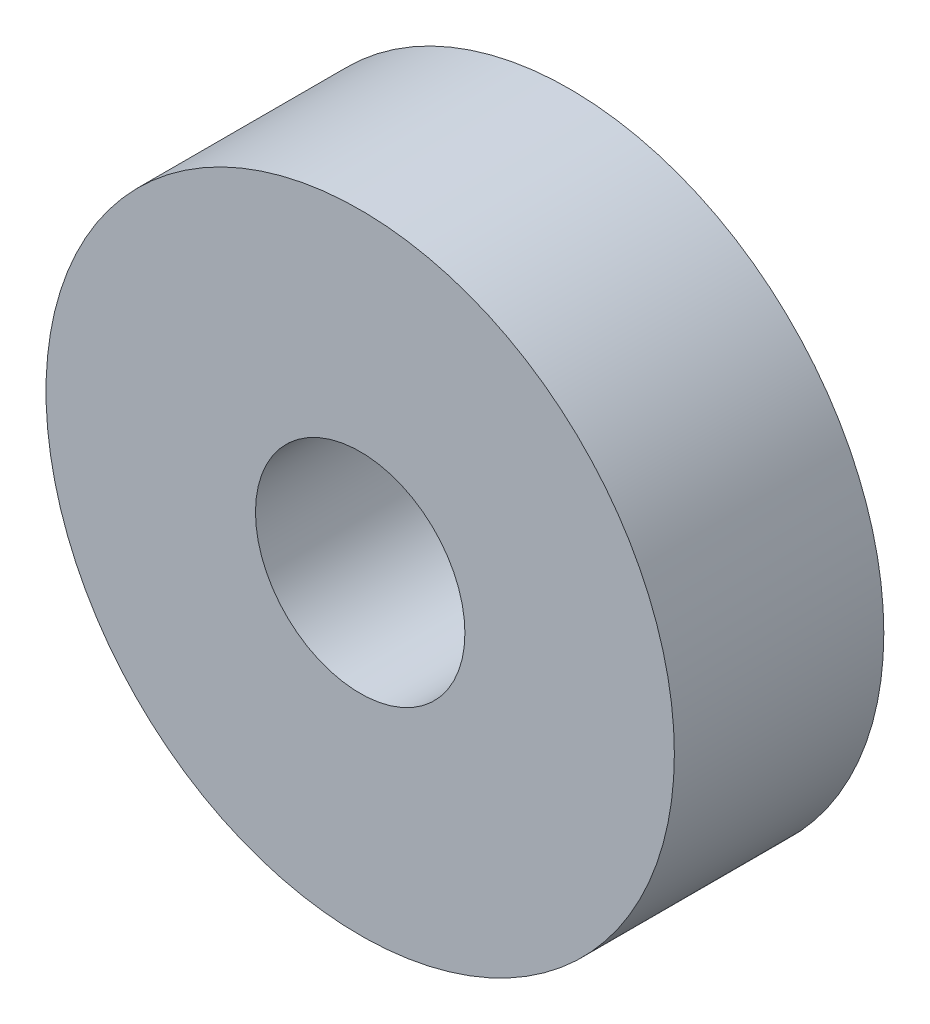
ISO-10303-21;
HEADER;
FILE_DESCRIPTION(('STEP AP214'),'2;1');
FILE_NAME('part.step','',(''),(''),'','','');
FILE_SCHEMA(('AUTOMOTIVE_DESIGN { 1 0 10303 214 1 1 1 1 }'));
ENDSEC;
DATA;
#1=APPLICATION_CONTEXT('core data for automotive mechanical design processes');
#2=APPLICATION_PROTOCOL_DEFINITION('international standard','automotive_design',2000,#1);
#3=PRODUCT_CONTEXT('',#1,'mechanical');
#4=PRODUCT('Part','Part','',(#3));
#5=PRODUCT_RELATED_PRODUCT_CATEGORY('part','',(#4));
#6=PRODUCT_DEFINITION_FORMATION('','',#4);
#7=PRODUCT_DEFINITION_CONTEXT('part definition',#1,'design');
#8=PRODUCT_DEFINITION('design','',#6,#7);
#9=PRODUCT_DEFINITION_SHAPE('','',#8);
#10=(LENGTH_UNIT() NAMED_UNIT(*) SI_UNIT(.MILLI.,.METRE.));
#11=(NAMED_UNIT(*) PLANE_ANGLE_UNIT() SI_UNIT($,.RADIAN.));
#12=(NAMED_UNIT(*) SI_UNIT($,.STERADIAN.) SOLID_ANGLE_UNIT());
#13=UNCERTAINTY_MEASURE_WITH_UNIT(LENGTH_MEASURE(1.E-05),#10,'distance_accuracy_value','');
#14=(GEOMETRIC_REPRESENTATION_CONTEXT(3) GLOBAL_UNCERTAINTY_ASSIGNED_CONTEXT((#13)) GLOBAL_UNIT_ASSIGNED_CONTEXT((#10,
#11,#12)) REPRESENTATION_CONTEXT('',''));
#15=CARTESIAN_POINT('',(0.,0.,0.));
#16=DIRECTION('',(0.,0.,1.));
#17=DIRECTION('',(1.,0.,0.));
#18=AXIS2_PLACEMENT_3D('',#15,#16,#17);
#19=CARTESIAN_POINT('',(0.,0.,8.));
#20=DIRECTION('',(0.,0.,1.));
#21=DIRECTION('',(1.,0.,0.));
#22=AXIS2_PLACEMENT_3D('',#19,#20,#21);
#23=PLANE('',#22);
#24=CARTESIAN_POINT('',(0.,0.,8.));
#25=DIRECTION('',(0.,0.,1.));
#26=DIRECTION('',(1.,0.,0.));
#27=AXIS2_PLACEMENT_3D('',#24,#25,#26);
#28=CIRCLE('',#27,12.);
#29=CARTESIAN_POINT('',(12.,0.,8.));
#30=VERTEX_POINT('',#29);
#31=EDGE_CURVE('E10',#30,#30,#28,.T.);
#32=ORIENTED_EDGE('',*,*,#31,.T.);
#33=EDGE_LOOP('',(#32));
#34=FACE_BOUND('',#33,.T.);
#35=CARTESIAN_POINT('',(0.,0.,8.));
#36=DIRECTION('',(0.,0.,1.));
#37=DIRECTION('',(1.,0.,0.));
#38=AXIS2_PLACEMENT_3D('',#35,#36,#37);
#39=CIRCLE('',#38,4.);
#40=CARTESIAN_POINT('',(4.,0.,8.));
#41=VERTEX_POINT('',#40);
#42=EDGE_CURVE('E56',#41,#41,#39,.T.);
#43=ORIENTED_EDGE('',*,*,#42,.F.);
#44=EDGE_LOOP('',(#43));
#45=FACE_BOUND('',#44,.T.);
#46=ADVANCED_FACE('F43',(#34,#45),#23,.T.);
#47=CARTESIAN_POINT('',(0.,0.,0.));
#48=DIRECTION('',(0.,0.,1.));
#49=DIRECTION('',(1.,0.,0.));
#50=AXIS2_PLACEMENT_3D('',#47,#48,#49);
#51=PLANE('',#50);
#52=CARTESIAN_POINT('',(0.,0.,0.));
#53=DIRECTION('',(0.,0.,1.));
#54=DIRECTION('',(1.,0.,0.));
#55=AXIS2_PLACEMENT_3D('',#52,#53,#54);
#56=CIRCLE('',#55,12.);
#57=CARTESIAN_POINT('',(12.,0.,0.));
#58=VERTEX_POINT('',#57);
#59=EDGE_CURVE('E47',#58,#58,#56,.T.);
#60=ORIENTED_EDGE('',*,*,#59,.F.);
#61=EDGE_LOOP('',(#60));
#62=FACE_BOUND('',#61,.T.);
#63=CARTESIAN_POINT('',(0.,0.,0.));
#64=DIRECTION('',(0.,0.,1.));
#65=DIRECTION('',(1.,0.,0.));
#66=AXIS2_PLACEMENT_3D('',#63,#64,#65);
#67=CIRCLE('',#66,4.);
#68=CARTESIAN_POINT('',(4.,0.,0.));
#69=VERTEX_POINT('',#68);
#70=EDGE_CURVE('E58',#69,#69,#67,.T.);
#71=ORIENTED_EDGE('',*,*,#70,.T.);
#72=EDGE_LOOP('',(#71));
#73=FACE_BOUND('',#72,.T.);
#74=ADVANCED_FACE('F70',(#62,#73),#51,.F.);
#75=CARTESIAN_POINT('',(0.,0.,8.));
#76=DIRECTION('',(0.,0.,-1.));
#77=DIRECTION('',(-1.,0.,0.));
#78=AXIS2_PLACEMENT_3D('',#75,#76,#77);
#79=CYLINDRICAL_SURFACE('',#78,12.);
#80=ORIENTED_EDGE('',*,*,#31,.F.);
#81=EDGE_LOOP('',(#80));
#82=FACE_BOUND('',#81,.T.);
#83=ORIENTED_EDGE('',*,*,#59,.T.);
#84=EDGE_LOOP('',(#83));
#85=FACE_BOUND('',#84,.T.);
#86=ADVANCED_FACE('F45',(#82,#85),#79,.T.);
#87=CARTESIAN_POINT('',(0.,0.,8.));
#88=DIRECTION('',(0.,0.,-1.));
#89=DIRECTION('',(-1.,0.,0.));
#90=AXIS2_PLACEMENT_3D('',#87,#88,#89);
#91=CYLINDRICAL_SURFACE('',#90,4.);
#92=ORIENTED_EDGE('',*,*,#42,.T.);
#93=EDGE_LOOP('',(#92));
#94=FACE_BOUND('',#93,.T.);
#95=ORIENTED_EDGE('',*,*,#70,.F.);
#96=EDGE_LOOP('',(#95));
#97=FACE_BOUND('',#96,.T.);
#98=ADVANCED_FACE('F66',(#94,#97),#91,.F.);
#99=CLOSED_SHELL('',(#46,#74,#86,#98));
#100=MANIFOLD_SOLID_BREP('B2',#99);
#101=ADVANCED_BREP_SHAPE_REPRESENTATION('',(#18,#100),#14);
#102=SHAPE_DEFINITION_REPRESENTATION(#9,#101);
ENDSEC;
END-ISO-10303-21;
